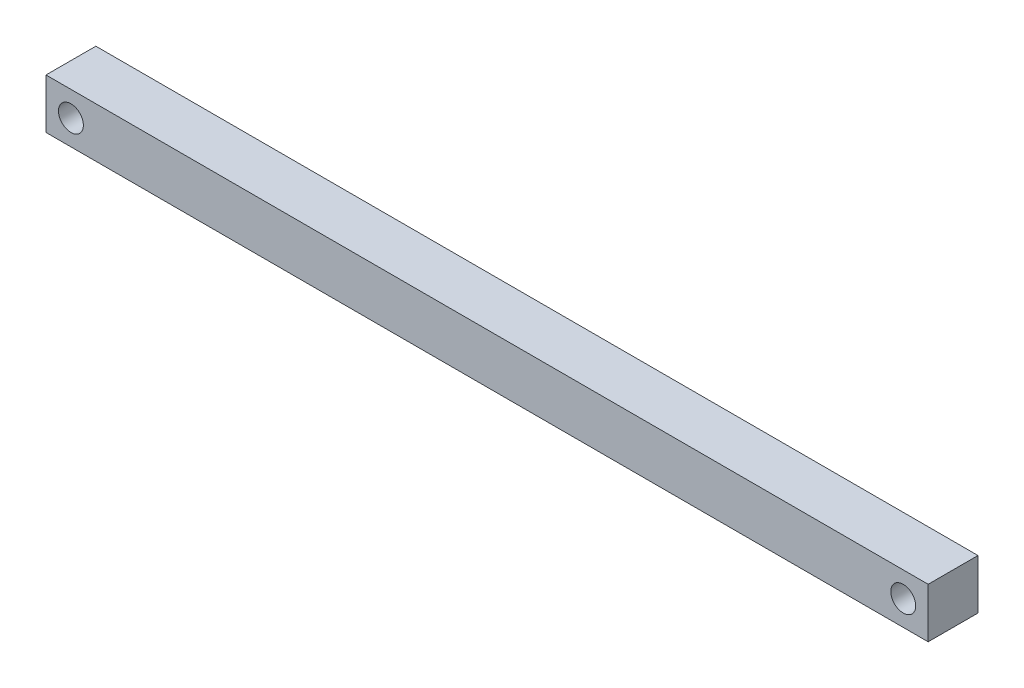
ISO-10303-21;
HEADER;
FILE_DESCRIPTION(('STEP AP214'),'2;1');
FILE_NAME('part.step','',(''),(''),'','','');
FILE_SCHEMA(('AUTOMOTIVE_DESIGN { 1 0 10303 214 1 1 1 1 }'));
ENDSEC;
DATA;
#1=APPLICATION_CONTEXT('core data for automotive mechanical design processes');
#2=APPLICATION_PROTOCOL_DEFINITION('international standard','automotive_design',2000,#1);
#3=PRODUCT_CONTEXT('',#1,'mechanical');
#4=PRODUCT('Part','Part','',(#3));
#5=PRODUCT_RELATED_PRODUCT_CATEGORY('part','',(#4));
#6=PRODUCT_DEFINITION_FORMATION('','',#4);
#7=PRODUCT_DEFINITION_CONTEXT('part definition',#1,'design');
#8=PRODUCT_DEFINITION('design','',#6,#7);
#9=PRODUCT_DEFINITION_SHAPE('','',#8);
#10=(LENGTH_UNIT() NAMED_UNIT(*) SI_UNIT(.MILLI.,.METRE.));
#11=(NAMED_UNIT(*) PLANE_ANGLE_UNIT() SI_UNIT($,.RADIAN.));
#12=(NAMED_UNIT(*) SI_UNIT($,.STERADIAN.) SOLID_ANGLE_UNIT());
#13=UNCERTAINTY_MEASURE_WITH_UNIT(LENGTH_MEASURE(1.E-05),#10,'distance_accuracy_value','');
#14=(GEOMETRIC_REPRESENTATION_CONTEXT(3) GLOBAL_UNCERTAINTY_ASSIGNED_CONTEXT((#13)) GLOBAL_UNIT_ASSIGNED_CONTEXT((#10,
#11,#12)) REPRESENTATION_CONTEXT('',''));
#15=CARTESIAN_POINT('',(0.,0.,0.));
#16=DIRECTION('',(0.,0.,1.));
#17=DIRECTION('',(1.,0.,0.));
#18=AXIS2_PLACEMENT_3D('',#15,#16,#17);
#19=CARTESIAN_POINT('',(0.,0.,15.));
#20=DIRECTION('',(0.,0.,-1.));
#21=DIRECTION('',(-1.,0.,0.));
#22=AXIS2_PLACEMENT_3D('',#19,#20,#21);
#23=PLANE('',#22);
#24=DIRECTION('',(0.,-1.,0.));
#25=VECTOR('',#24,1.);
#26=CARTESIAN_POINT('',(-265.5,15.,15.));
#27=LINE('',#26,#25);
#28=CARTESIAN_POINT('',(-265.5,15.,15.));
#29=VERTEX_POINT('',#28);
#30=CARTESIAN_POINT('',(-265.5,-15.,15.));
#31=VERTEX_POINT('',#30);
#32=EDGE_CURVE('E106',#29,#31,#27,.T.);
#33=ORIENTED_EDGE('',*,*,#32,.T.);
#34=DIRECTION('',(1.,0.,0.));
#35=VECTOR('',#34,1.);
#36=CARTESIAN_POINT('',(265.5,-15.,15.));
#37=LINE('',#36,#35);
#38=CARTESIAN_POINT('',(265.5,-15.,15.));
#39=VERTEX_POINT('',#38);
#40=EDGE_CURVE('E101',#31,#39,#37,.T.);
#41=ORIENTED_EDGE('',*,*,#40,.T.);
#42=DIRECTION('',(0.,1.,0.));
#43=VECTOR('',#42,1.);
#44=CARTESIAN_POINT('',(265.5,15.,15.));
#45=LINE('',#44,#43);
#46=CARTESIAN_POINT('',(265.5,15.,15.));
#47=VERTEX_POINT('',#46);
#48=EDGE_CURVE('E104',#39,#47,#45,.T.);
#49=ORIENTED_EDGE('',*,*,#48,.T.);
#50=DIRECTION('',(-1.,0.,0.));
#51=VECTOR('',#50,1.);
#52=CARTESIAN_POINT('',(265.5,15.,15.));
#53=LINE('',#52,#51);
#54=EDGE_CURVE('E67',#47,#29,#53,.T.);
#55=ORIENTED_EDGE('',*,*,#54,.T.);
#56=EDGE_LOOP('',(#33,#41,#49,#55));
#57=FACE_BOUND('',#56,.T.);
#58=CARTESIAN_POINT('',(250.5,0.,15.));
#59=DIRECTION('',(0.,0.,1.));
#60=DIRECTION('',(1.,0.,0.));
#61=AXIS2_PLACEMENT_3D('',#58,#59,#60);
#62=CIRCLE('',#61,7.50000000000013);
#63=CARTESIAN_POINT('',(258.,0.,15.));
#64=VERTEX_POINT('',#63);
#65=EDGE_CURVE('E127',#64,#64,#62,.T.);
#66=ORIENTED_EDGE('',*,*,#65,.F.);
#67=EDGE_LOOP('',(#66));
#68=FACE_BOUND('',#67,.T.);
#69=CARTESIAN_POINT('',(-250.5,0.,15.));
#70=DIRECTION('',(0.,0.,1.));
#71=DIRECTION('',(1.,0.,0.));
#72=AXIS2_PLACEMENT_3D('',#69,#70,#71);
#73=CIRCLE('',#72,7.50000000000001);
#74=CARTESIAN_POINT('',(-243.,0.,15.));
#75=VERTEX_POINT('',#74);
#76=EDGE_CURVE('E150',#75,#75,#73,.T.);
#77=ORIENTED_EDGE('',*,*,#76,.F.);
#78=EDGE_LOOP('',(#77));
#79=FACE_BOUND('',#78,.T.);
#80=ADVANCED_FACE('F46',(#57,#68,#79),#23,.F.);
#81=CARTESIAN_POINT('',(0.,0.,-15.));
#82=DIRECTION('',(0.,0.,-1.));
#83=DIRECTION('',(-1.,0.,0.));
#84=AXIS2_PLACEMENT_3D('',#81,#82,#83);
#85=PLANE('',#84);
#86=CARTESIAN_POINT('',(250.5,0.,-15.));
#87=DIRECTION('',(0.,0.,1.));
#88=DIRECTION('',(1.,0.,0.));
#89=AXIS2_PLACEMENT_3D('',#86,#87,#88);
#90=CIRCLE('',#89,7.50000000000013);
#91=CARTESIAN_POINT('',(258.,0.,-15.));
#92=VERTEX_POINT('',#91);
#93=EDGE_CURVE('E146',#92,#92,#90,.T.);
#94=ORIENTED_EDGE('',*,*,#93,.T.);
#95=EDGE_LOOP('',(#94));
#96=FACE_BOUND('',#95,.T.);
#97=DIRECTION('',(0.,-1.,0.));
#98=VECTOR('',#97,1.);
#99=CARTESIAN_POINT('',(-265.5,15.,-15.));
#100=LINE('',#99,#98);
#101=CARTESIAN_POINT('',(-265.5,15.,-15.));
#102=VERTEX_POINT('',#101);
#103=CARTESIAN_POINT('',(-265.5,-15.,-15.));
#104=VERTEX_POINT('',#103);
#105=EDGE_CURVE('E123',#102,#104,#100,.T.);
#106=ORIENTED_EDGE('',*,*,#105,.F.);
#107=DIRECTION('',(-1.,0.,0.));
#108=VECTOR('',#107,1.);
#109=CARTESIAN_POINT('',(265.5,15.,-15.));
#110=LINE('',#109,#108);
#111=CARTESIAN_POINT('',(265.5,15.,-15.));
#112=VERTEX_POINT('',#111);
#113=EDGE_CURVE('E94',#112,#102,#110,.T.);
#114=ORIENTED_EDGE('',*,*,#113,.F.);
#115=DIRECTION('',(0.,1.,0.));
#116=VECTOR('',#115,1.);
#117=CARTESIAN_POINT('',(265.5,15.,-15.));
#118=LINE('',#117,#116);
#119=CARTESIAN_POINT('',(265.5,-15.,-15.));
#120=VERTEX_POINT('',#119);
#121=EDGE_CURVE('E88',#120,#112,#118,.T.);
#122=ORIENTED_EDGE('',*,*,#121,.F.);
#123=DIRECTION('',(1.,0.,0.));
#124=VECTOR('',#123,1.);
#125=CARTESIAN_POINT('',(265.5,-15.,-15.));
#126=LINE('',#125,#124);
#127=EDGE_CURVE('E111',#104,#120,#126,.T.);
#128=ORIENTED_EDGE('',*,*,#127,.F.);
#129=EDGE_LOOP('',(#106,#114,#122,#128));
#130=FACE_BOUND('',#129,.T.);
#131=CARTESIAN_POINT('',(-250.5,0.,-15.));
#132=DIRECTION('',(0.,0.,1.));
#133=DIRECTION('',(1.,0.,0.));
#134=AXIS2_PLACEMENT_3D('',#131,#132,#133);
#135=CIRCLE('',#134,7.50000000000001);
#136=CARTESIAN_POINT('',(-243.,0.,-15.));
#137=VERTEX_POINT('',#136);
#138=EDGE_CURVE('E154',#137,#137,#135,.T.);
#139=ORIENTED_EDGE('',*,*,#138,.T.);
#140=EDGE_LOOP('',(#139));
#141=FACE_BOUND('',#140,.T.);
#142=ADVANCED_FACE('F139',(#96,#130,#141),#85,.T.);
#143=CARTESIAN_POINT('',(-265.5,15.,15.));
#144=DIRECTION('',(1.,0.,0.));
#145=DIRECTION('',(0.,0.,-1.));
#146=AXIS2_PLACEMENT_3D('',#143,#144,#145);
#147=PLANE('',#146);
#148=ORIENTED_EDGE('',*,*,#105,.T.);
#149=DIRECTION('',(0.,0.,-1.));
#150=VECTOR('',#149,1.);
#151=CARTESIAN_POINT('',(-265.5,-15.,15.));
#152=LINE('',#151,#150);
#153=EDGE_CURVE('E11',#31,#104,#152,.T.);
#154=ORIENTED_EDGE('',*,*,#153,.F.);
#155=ORIENTED_EDGE('',*,*,#32,.F.);
#156=DIRECTION('',(0.,0.,-1.));
#157=VECTOR('',#156,1.);
#158=CARTESIAN_POINT('',(-265.5,15.,15.));
#159=LINE('',#158,#157);
#160=EDGE_CURVE('E119',#29,#102,#159,.T.);
#161=ORIENTED_EDGE('',*,*,#160,.T.);
#162=EDGE_LOOP('',(#148,#154,#155,#161));
#163=FACE_BOUND('',#162,.T.);
#164=ADVANCED_FACE('F48',(#163),#147,.F.);
#165=CARTESIAN_POINT('',(265.5,-15.,15.));
#166=DIRECTION('',(0.,1.,0.));
#167=DIRECTION('',(0.,0.,1.));
#168=AXIS2_PLACEMENT_3D('',#165,#166,#167);
#169=PLANE('',#168);
#170=ORIENTED_EDGE('',*,*,#127,.T.);
#171=DIRECTION('',(0.,0.,-1.));
#172=VECTOR('',#171,1.);
#173=CARTESIAN_POINT('',(265.5,-15.,15.));
#174=LINE('',#173,#172);
#175=EDGE_CURVE('E56',#39,#120,#174,.T.);
#176=ORIENTED_EDGE('',*,*,#175,.F.);
#177=ORIENTED_EDGE('',*,*,#40,.F.);
#178=ORIENTED_EDGE('',*,*,#153,.T.);
#179=EDGE_LOOP('',(#170,#176,#177,#178));
#180=FACE_BOUND('',#179,.T.);
#181=ADVANCED_FACE('F110',(#180),#169,.F.);
#182=CARTESIAN_POINT('',(265.5,15.,15.));
#183=DIRECTION('',(-1.,0.,0.));
#184=DIRECTION('',(0.,0.,1.));
#185=AXIS2_PLACEMENT_3D('',#182,#183,#184);
#186=PLANE('',#185);
#187=ORIENTED_EDGE('',*,*,#121,.T.);
#188=DIRECTION('',(0.,0.,-1.));
#189=VECTOR('',#188,1.);
#190=CARTESIAN_POINT('',(265.5,15.,15.));
#191=LINE('',#190,#189);
#192=EDGE_CURVE('E113',#47,#112,#191,.T.);
#193=ORIENTED_EDGE('',*,*,#192,.F.);
#194=ORIENTED_EDGE('',*,*,#48,.F.);
#195=ORIENTED_EDGE('',*,*,#175,.T.);
#196=EDGE_LOOP('',(#187,#193,#194,#195));
#197=FACE_BOUND('',#196,.T.);
#198=ADVANCED_FACE('F114',(#197),#186,.F.);
#199=CARTESIAN_POINT('',(265.5,15.,15.));
#200=DIRECTION('',(0.,-1.,0.));
#201=DIRECTION('',(0.,0.,-1.));
#202=AXIS2_PLACEMENT_3D('',#199,#200,#201);
#203=PLANE('',#202);
#204=ORIENTED_EDGE('',*,*,#113,.T.);
#205=ORIENTED_EDGE('',*,*,#160,.F.);
#206=ORIENTED_EDGE('',*,*,#54,.F.);
#207=ORIENTED_EDGE('',*,*,#192,.T.);
#208=EDGE_LOOP('',(#204,#205,#206,#207));
#209=FACE_BOUND('',#208,.T.);
#210=ADVANCED_FACE('F136',(#209),#203,.F.);
#211=CARTESIAN_POINT('',(250.5,0.,15.));
#212=DIRECTION('',(0.,0.,-1.));
#213=DIRECTION('',(-1.,0.,0.));
#214=AXIS2_PLACEMENT_3D('',#211,#212,#213);
#215=CYLINDRICAL_SURFACE('',#214,7.50000000000013);
#216=ORIENTED_EDGE('',*,*,#65,.T.);
#217=EDGE_LOOP('',(#216));
#218=FACE_BOUND('',#217,.T.);
#219=ORIENTED_EDGE('',*,*,#93,.F.);
#220=EDGE_LOOP('',(#219));
#221=FACE_BOUND('',#220,.T.);
#222=ADVANCED_FACE('F170',(#218,#221),#215,.F.);
#223=CARTESIAN_POINT('',(-250.5,0.,15.));
#224=DIRECTION('',(0.,0.,-1.));
#225=DIRECTION('',(-1.,0.,0.));
#226=AXIS2_PLACEMENT_3D('',#223,#224,#225);
#227=CYLINDRICAL_SURFACE('',#226,7.50000000000001);
#228=ORIENTED_EDGE('',*,*,#76,.T.);
#229=EDGE_LOOP('',(#228));
#230=FACE_BOUND('',#229,.T.);
#231=ORIENTED_EDGE('',*,*,#138,.F.);
#232=EDGE_LOOP('',(#231));
#233=FACE_BOUND('',#232,.T.);
#234=ADVANCED_FACE('F160',(#230,#233),#227,.F.);
#235=CLOSED_SHELL('',(#80,#142,#164,#181,#198,#210,#222,#234));
#236=MANIFOLD_SOLID_BREP('B2',#235);
#237=ADVANCED_BREP_SHAPE_REPRESENTATION('',(#18,#236),#14);
#238=SHAPE_DEFINITION_REPRESENTATION(#9,#237);
ENDSEC;
END-ISO-10303-21;
